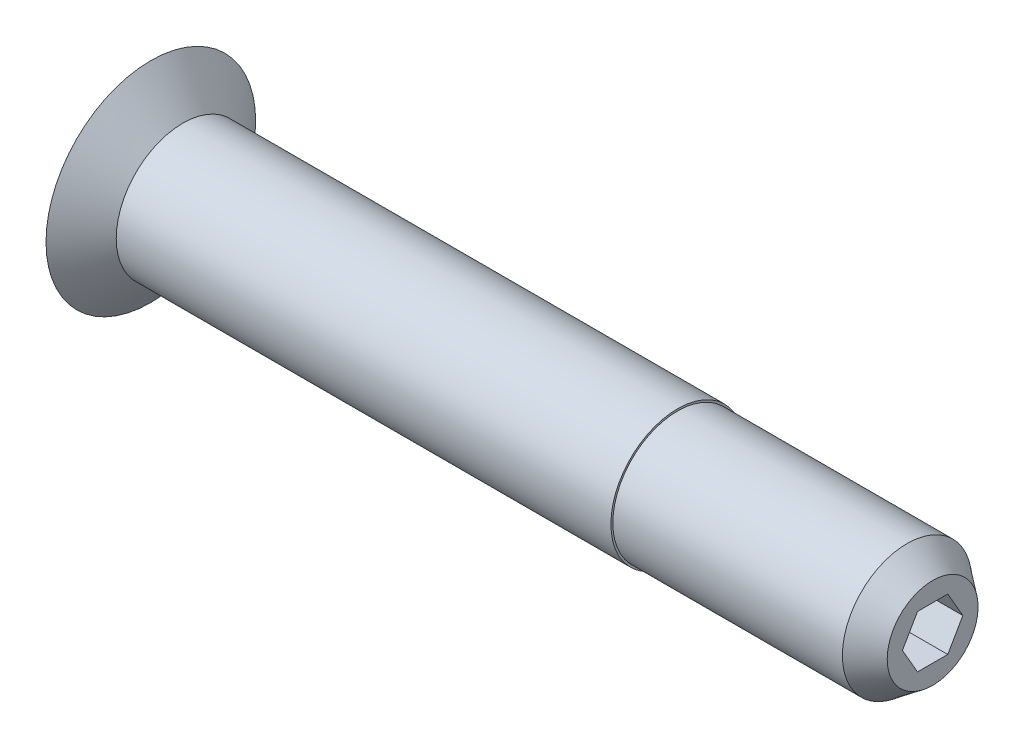
ISO-10303-21;
HEADER;
FILE_DESCRIPTION(('STEP AP214'),'2;1');
FILE_NAME('part.step','',(''),(''),'','','');
FILE_SCHEMA(('AUTOMOTIVE_DESIGN { 1 0 10303 214 1 1 1 1 }'));
ENDSEC;
DATA;
#1=APPLICATION_CONTEXT('core data for automotive mechanical design processes');
#2=APPLICATION_PROTOCOL_DEFINITION('international standard','automotive_design',2000,#1);
#3=PRODUCT_CONTEXT('',#1,'mechanical');
#4=PRODUCT('Part','Part','',(#3));
#5=PRODUCT_RELATED_PRODUCT_CATEGORY('part','',(#4));
#6=PRODUCT_DEFINITION_FORMATION('','',#4);
#7=PRODUCT_DEFINITION_CONTEXT('part definition',#1,'design');
#8=PRODUCT_DEFINITION('design','',#6,#7);
#9=PRODUCT_DEFINITION_SHAPE('','',#8);
#10=(LENGTH_UNIT() NAMED_UNIT(*) SI_UNIT(.MILLI.,.METRE.));
#11=(NAMED_UNIT(*) PLANE_ANGLE_UNIT() SI_UNIT($,.RADIAN.));
#12=(NAMED_UNIT(*) SI_UNIT($,.STERADIAN.) SOLID_ANGLE_UNIT());
#13=UNCERTAINTY_MEASURE_WITH_UNIT(LENGTH_MEASURE(1.E-05),#10,'distance_accuracy_value','');
#14=(GEOMETRIC_REPRESENTATION_CONTEXT(3) GLOBAL_UNCERTAINTY_ASSIGNED_CONTEXT((#13)) GLOBAL_UNIT_ASSIGNED_CONTEXT((#10,
#11,#12)) REPRESENTATION_CONTEXT('',''));
#15=CARTESIAN_POINT('',(0.,0.,0.));
#16=DIRECTION('',(0.,0.,1.));
#17=DIRECTION('',(1.,0.,0.));
#18=AXIS2_PLACEMENT_3D('',#15,#16,#17);
#19=CARTESIAN_POINT('',(21.6916,0.,0.938540597594654));
#20=DIRECTION('',(0.,-0.50000000000001,-0.866025403784433));
#21=DIRECTION('',(0.,-0.866025403784433,0.50000000000001));
#22=AXIS2_PLACEMENT_3D('',#19,#20,#21);
#23=PLANE('',#22);
#24=DIRECTION('',(0.,0.866025403784433,-0.50000000000001));
#25=VECTOR('',#24,1.);
#26=CARTESIAN_POINT('',(24.8666,0.,0.938540597594654));
#27=LINE('',#26,#25);
#28=CARTESIAN_POINT('',(24.8666,0.,0.938540597594654));
#29=VERTEX_POINT('',#28);
#30=CARTESIAN_POINT('',(24.8666,0.8128,0.469270298797319));
#31=VERTEX_POINT('',#30);
#32=EDGE_CURVE('E200',#29,#31,#27,.T.);
#33=ORIENTED_EDGE('',*,*,#32,.F.);
#34=DIRECTION('',(1.,0.,0.));
#35=VECTOR('',#34,1.);
#36=CARTESIAN_POINT('',(21.6916,0.,0.938540597594654));
#37=LINE('',#36,#35);
#38=CARTESIAN_POINT('',(21.6916,0.,0.938540597594654));
#39=VERTEX_POINT('',#38);
#40=EDGE_CURVE('E11',#39,#29,#37,.T.);
#41=ORIENTED_EDGE('',*,*,#40,.F.);
#42=DIRECTION('',(0.,0.866025403784433,-0.50000000000001));
#43=VECTOR('',#42,1.);
#44=CARTESIAN_POINT('',(21.6916,0.,0.938540597594654));
#45=LINE('',#44,#43);
#46=CARTESIAN_POINT('',(21.6916,0.8128,0.469270298797319));
#47=VERTEX_POINT('',#46);
#48=EDGE_CURVE('E155',#39,#47,#45,.T.);
#49=ORIENTED_EDGE('',*,*,#48,.T.);
#50=DIRECTION('',(1.,0.,0.));
#51=VECTOR('',#50,1.);
#52=CARTESIAN_POINT('',(21.6916,0.8128,0.469270298797325));
#53=LINE('',#52,#51);
#54=EDGE_CURVE('E197',#47,#31,#53,.T.);
#55=ORIENTED_EDGE('',*,*,#54,.T.);
#56=EDGE_LOOP('',(#33,#41,#49,#55));
#57=FACE_BOUND('',#56,.T.);
#58=ADVANCED_FACE('F59',(#57),#23,.T.);
#59=CARTESIAN_POINT('',(21.6916,-0.8128,0.469270298797337));
#60=DIRECTION('',(0.,0.499999999999992,-0.866025403784443));
#61=DIRECTION('',(-1.,0.,0.));
#62=AXIS2_PLACEMENT_3D('',#59,#60,#61);
#63=PLANE('',#62);
#64=DIRECTION('',(0.,0.866025403784443,0.499999999999992));
#65=VECTOR('',#64,1.);
#66=CARTESIAN_POINT('',(24.8666,-0.8128,0.469270298797337));
#67=LINE('',#66,#65);
#68=CARTESIAN_POINT('',(24.8666,-0.8128,0.469270298797337));
#69=VERTEX_POINT('',#68);
#70=EDGE_CURVE('E138',#69,#29,#67,.T.);
#71=ORIENTED_EDGE('',*,*,#70,.F.);
#72=DIRECTION('',(1.,0.,0.));
#73=VECTOR('',#72,1.);
#74=CARTESIAN_POINT('',(21.6916,-0.8128,0.469270298797325));
#75=LINE('',#74,#73);
#76=CARTESIAN_POINT('',(21.6916,-0.8128,0.469270298797325));
#77=VERTEX_POINT('',#76);
#78=EDGE_CURVE('E69',#77,#69,#75,.T.);
#79=ORIENTED_EDGE('',*,*,#78,.F.);
#80=DIRECTION('',(0.,0.866025403784443,0.499999999999992));
#81=VECTOR('',#80,1.);
#82=CARTESIAN_POINT('',(21.6916,-0.8128,0.469270298797337));
#83=LINE('',#82,#81);
#84=EDGE_CURVE('E135',#77,#39,#83,.T.);
#85=ORIENTED_EDGE('',*,*,#84,.T.);
#86=ORIENTED_EDGE('',*,*,#40,.T.);
#87=EDGE_LOOP('',(#71,#79,#85,#86));
#88=FACE_BOUND('',#87,.T.);
#89=ADVANCED_FACE('F133',(#88),#63,.T.);
#90=CARTESIAN_POINT('',(21.6916,-0.8128,-0.469270298797325));
#91=DIRECTION('',(0.,1.,0.));
#92=DIRECTION('',(1.,0.,0.));
#93=AXIS2_PLACEMENT_3D('',#90,#91,#92);
#94=PLANE('',#93);
#95=DIRECTION('',(0.,0.,1.));
#96=VECTOR('',#95,1.);
#97=CARTESIAN_POINT('',(24.8666,-0.8128,-0.469270298797325));
#98=LINE('',#97,#96);
#99=CARTESIAN_POINT('',(24.8666,-0.8128,-0.469270298797325));
#100=VERTEX_POINT('',#99);
#101=EDGE_CURVE('E178',#100,#69,#98,.T.);
#102=ORIENTED_EDGE('',*,*,#101,.F.);
#103=DIRECTION('',(1.,0.,0.));
#104=VECTOR('',#103,1.);
#105=CARTESIAN_POINT('',(21.6916,-0.8128,-0.469270298797325));
#106=LINE('',#105,#104);
#107=CARTESIAN_POINT('',(21.6916,-0.8128,-0.469270298797325));
#108=VERTEX_POINT('',#107);
#109=EDGE_CURVE('E62',#108,#100,#106,.T.);
#110=ORIENTED_EDGE('',*,*,#109,.F.);
#111=DIRECTION('',(0.,0.,1.));
#112=VECTOR('',#111,1.);
#113=CARTESIAN_POINT('',(21.6916,-0.8128,-0.469270298797325));
#114=LINE('',#113,#112);
#115=EDGE_CURVE('E145',#108,#77,#114,.T.);
#116=ORIENTED_EDGE('',*,*,#115,.T.);
#117=ORIENTED_EDGE('',*,*,#78,.T.);
#118=EDGE_LOOP('',(#102,#110,#116,#117));
#119=FACE_BOUND('',#118,.T.);
#120=ADVANCED_FACE('F146',(#119),#94,.T.);
#121=CARTESIAN_POINT('',(21.6916,0.,-0.938540597594654));
#122=DIRECTION('',(0.,0.5,0.866025403784436));
#123=DIRECTION('',(1.,0.,0.));
#124=AXIS2_PLACEMENT_3D('',#121,#122,#123);
#125=PLANE('',#124);
#126=DIRECTION('',(0.,-0.866025403784436,0.5));
#127=VECTOR('',#126,1.);
#128=CARTESIAN_POINT('',(24.8666,0.,-0.938540597594654));
#129=LINE('',#128,#127);
#130=CARTESIAN_POINT('',(24.8666,0.,-0.938540597594654));
#131=VERTEX_POINT('',#130);
#132=EDGE_CURVE('E176',#131,#100,#129,.T.);
#133=ORIENTED_EDGE('',*,*,#132,.F.);
#134=DIRECTION('',(1.,0.,0.));
#135=VECTOR('',#134,1.);
#136=CARTESIAN_POINT('',(21.6916,0.,-0.938540597594654));
#137=LINE('',#136,#135);
#138=CARTESIAN_POINT('',(21.6916,0.,-0.938540597594654));
#139=VERTEX_POINT('',#138);
#140=EDGE_CURVE('E82',#139,#131,#137,.T.);
#141=ORIENTED_EDGE('',*,*,#140,.F.);
#142=DIRECTION('',(0.,-0.866025403784436,0.5));
#143=VECTOR('',#142,1.);
#144=CARTESIAN_POINT('',(21.6916,0.,-0.938540597594654));
#145=LINE('',#144,#143);
#146=EDGE_CURVE('E150',#139,#108,#145,.T.);
#147=ORIENTED_EDGE('',*,*,#146,.T.);
#148=ORIENTED_EDGE('',*,*,#109,.T.);
#149=EDGE_LOOP('',(#133,#141,#147,#148));
#150=FACE_BOUND('',#149,.T.);
#151=ADVANCED_FACE('F174',(#150),#125,.T.);
#152=CARTESIAN_POINT('',(21.6916,0.8128,-0.469270298797331));
#153=DIRECTION('',(0.,-0.5,0.86602540378444));
#154=DIRECTION('',(-1.,0.,0.));
#155=AXIS2_PLACEMENT_3D('',#152,#153,#154);
#156=PLANE('',#155);
#157=DIRECTION('',(0.,-0.86602540378444,-0.5));
#158=VECTOR('',#157,1.);
#159=CARTESIAN_POINT('',(24.8666,0.8128,-0.469270298797331));
#160=LINE('',#159,#158);
#161=CARTESIAN_POINT('',(24.8666,0.8128,-0.469270298797331));
#162=VERTEX_POINT('',#161);
#163=EDGE_CURVE('E185',#162,#131,#160,.T.);
#164=ORIENTED_EDGE('',*,*,#163,.F.);
#165=DIRECTION('',(1.,0.,0.));
#166=VECTOR('',#165,1.);
#167=CARTESIAN_POINT('',(21.6916,0.8128,-0.469270298797325));
#168=LINE('',#167,#166);
#169=CARTESIAN_POINT('',(21.6916,0.8128,-0.469270298797331));
#170=VERTEX_POINT('',#169);
#171=EDGE_CURVE('E160',#170,#162,#168,.T.);
#172=ORIENTED_EDGE('',*,*,#171,.F.);
#173=DIRECTION('',(0.,-0.86602540378444,-0.5));
#174=VECTOR('',#173,1.);
#175=CARTESIAN_POINT('',(21.6916,0.8128,-0.469270298797331));
#176=LINE('',#175,#174);
#177=EDGE_CURVE('E166',#170,#139,#176,.T.);
#178=ORIENTED_EDGE('',*,*,#177,.T.);
#179=ORIENTED_EDGE('',*,*,#140,.T.);
#180=EDGE_LOOP('',(#164,#172,#178,#179));
#181=FACE_BOUND('',#180,.T.);
#182=ADVANCED_FACE('F226',(#181),#156,.T.);
#183=CARTESIAN_POINT('',(21.6916,0.,0.));
#184=DIRECTION('',(-1.,0.,0.));
#185=DIRECTION('',(0.,0.,1.));
#186=AXIS2_PLACEMENT_3D('',#183,#184,#185);
#187=PLANE('',#186);
#188=DIRECTION('',(0.,0.,-1.));
#189=VECTOR('',#188,1.);
#190=CARTESIAN_POINT('',(21.6916,0.8128,0.469270298797325));
#191=LINE('',#190,#189);
#192=EDGE_CURVE('E213',#47,#170,#191,.T.);
#193=ORIENTED_EDGE('',*,*,#192,.F.);
#194=ORIENTED_EDGE('',*,*,#48,.F.);
#195=ORIENTED_EDGE('',*,*,#84,.F.);
#196=ORIENTED_EDGE('',*,*,#115,.F.);
#197=ORIENTED_EDGE('',*,*,#146,.F.);
#198=ORIENTED_EDGE('',*,*,#177,.F.);
#199=EDGE_LOOP('',(#193,#194,#195,#196,#197,#198));
#200=FACE_BOUND('',#199,.T.);
#201=ADVANCED_FACE('F153',(#200),#187,.F.);
#202=CARTESIAN_POINT('',(21.6916,0.8128,0.469270298797325));
#203=DIRECTION('',(0.,-1.,0.));
#204=DIRECTION('',(0.,0.,-1.));
#205=AXIS2_PLACEMENT_3D('',#202,#203,#204);
#206=PLANE('',#205);
#207=DIRECTION('',(0.,0.,-1.));
#208=VECTOR('',#207,1.);
#209=CARTESIAN_POINT('',(24.8666,0.8128,0.469270298797325));
#210=LINE('',#209,#208);
#211=EDGE_CURVE('E205',#31,#162,#210,.T.);
#212=ORIENTED_EDGE('',*,*,#211,.F.);
#213=ORIENTED_EDGE('',*,*,#54,.F.);
#214=ORIENTED_EDGE('',*,*,#192,.T.);
#215=ORIENTED_EDGE('',*,*,#171,.T.);
#216=EDGE_LOOP('',(#212,#213,#214,#215));
#217=FACE_BOUND('',#216,.T.);
#218=ADVANCED_FACE('F222',(#217),#206,.T.);
#219=CARTESIAN_POINT('',(-1000.,0.,0.));
#220=DIRECTION('',(-1.,0.,0.));
#221=DIRECTION('',(0.,0.,1.));
#222=AXIS2_PLACEMENT_3D('',#219,#220,#221);
#223=CYLINDRICAL_SURFACE('',#222,2.0701);
#224=CARTESIAN_POINT('',(1.57479999999999,0.,0.));
#225=DIRECTION('',(1.,0.,0.));
#226=DIRECTION('',(0.,0.,-1.));
#227=AXIS2_PLACEMENT_3D('',#224,#225,#226);
#228=CIRCLE('',#227,2.0701);
#229=CARTESIAN_POINT('',(1.57479999999999,0.,-2.0701));
#230=VERTEX_POINT('',#229);
#231=EDGE_CURVE('E264',#230,#230,#228,.F.);
#232=ORIENTED_EDGE('',*,*,#231,.F.);
#233=EDGE_LOOP('',(#232));
#234=FACE_BOUND('',#233,.T.);
#235=CARTESIAN_POINT('',(16.9418,0.,0.));
#236=DIRECTION('',(-1.,0.,0.));
#237=DIRECTION('',(0.,0.,1.));
#238=AXIS2_PLACEMENT_3D('',#235,#236,#237);
#239=CIRCLE('',#238,2.0701);
#240=CARTESIAN_POINT('',(16.9418,0.,2.0701));
#241=VERTEX_POINT('',#240);
#242=EDGE_CURVE('E194',#241,#241,#239,.T.);
#243=ORIENTED_EDGE('',*,*,#242,.T.);
#244=EDGE_LOOP('',(#243));
#245=FACE_BOUND('',#244,.T.);
#246=ADVANCED_FACE('F281',(#234,#245),#223,.T.);
#247=CARTESIAN_POINT('',(16.9418,2.0701,0.));
#248=DIRECTION('',(-1.,0.,0.));
#249=DIRECTION('',(0.,0.,1.));
#250=AXIS2_PLACEMENT_3D('',#247,#248,#249);
#251=PLANE('',#250);
#252=CARTESIAN_POINT('',(16.9418,0.,0.));
#253=DIRECTION('',(-1.,0.,0.));
#254=DIRECTION('',(0.,0.,1.));
#255=AXIS2_PLACEMENT_3D('',#252,#253,#254);
#256=CIRCLE('',#255,2.009775);
#257=CARTESIAN_POINT('',(16.9418,0.,2.009775));
#258=VERTEX_POINT('',#257);
#259=EDGE_CURVE('E198',#258,#258,#256,.T.);
#260=ORIENTED_EDGE('',*,*,#259,.T.);
#261=EDGE_LOOP('',(#260));
#262=FACE_BOUND('',#261,.T.);
#263=ORIENTED_EDGE('',*,*,#242,.F.);
#264=EDGE_LOOP('',(#263));
#265=FACE_BOUND('',#264,.T.);
#266=ADVANCED_FACE('F256',(#262,#265),#251,.F.);
#267=CARTESIAN_POINT('',(-1000.,0.,0.));
#268=DIRECTION('',(-1.,0.,0.));
#269=DIRECTION('',(0.,0.,1.));
#270=AXIS2_PLACEMENT_3D('',#267,#268,#269);
#271=CYLINDRICAL_SURFACE('',#270,2.009775);
#272=ORIENTED_EDGE('',*,*,#259,.F.);
#273=EDGE_LOOP('',(#272));
#274=FACE_BOUND('',#273,.T.);
#275=CARTESIAN_POINT('',(24.07285,0.,0.));
#276=DIRECTION('',(-1.,0.,0.));
#277=DIRECTION('',(0.,0.,1.));
#278=AXIS2_PLACEMENT_3D('',#275,#276,#277);
#279=CIRCLE('',#278,2.009775);
#280=CARTESIAN_POINT('',(24.07285,0.,2.009775));
#281=VERTEX_POINT('',#280);
#282=EDGE_CURVE('E208',#281,#281,#279,.T.);
#283=ORIENTED_EDGE('',*,*,#282,.T.);
#284=EDGE_LOOP('',(#283));
#285=FACE_BOUND('',#284,.T.);
#286=ADVANCED_FACE('F287',(#274,#285),#271,.T.);
#287=CARTESIAN_POINT('',(24.8666,0.,0.));
#288=DIRECTION('',(-1.,0.,0.));
#289=DIRECTION('',(0.,0.,1.));
#290=AXIS2_PLACEMENT_3D('',#287,#288,#289);
#291=CONICAL_SURFACE('',#290,1.41164147273091,0.645771823237948);
#292=CARTESIAN_POINT('',(24.8666,0.,0.));
#293=DIRECTION('',(-1.,0.,0.));
#294=DIRECTION('',(0.,0.,1.));
#295=AXIS2_PLACEMENT_3D('',#292,#293,#294);
#296=CIRCLE('',#295,1.41164147273091);
#297=CARTESIAN_POINT('',(24.8666,0.,1.41164147273091));
#298=VERTEX_POINT('',#297);
#299=EDGE_CURVE('E190',#298,#298,#296,.T.);
#300=ORIENTED_EDGE('',*,*,#299,.T.);
#301=EDGE_LOOP('',(#300));
#302=FACE_BOUND('',#301,.T.);
#303=ORIENTED_EDGE('',*,*,#282,.F.);
#304=EDGE_LOOP('',(#303));
#305=FACE_BOUND('',#304,.T.);
#306=ADVANCED_FACE('F294',(#302,#305),#291,.T.);
#307=CARTESIAN_POINT('',(24.8666,1.41164147273091,0.));
#308=DIRECTION('',(-1.,0.,0.));
#309=DIRECTION('',(0.,0.,1.));
#310=AXIS2_PLACEMENT_3D('',#307,#308,#309);
#311=PLANE('',#310);
#312=ORIENTED_EDGE('',*,*,#163,.T.);
#313=ORIENTED_EDGE('',*,*,#132,.T.);
#314=ORIENTED_EDGE('',*,*,#101,.T.);
#315=ORIENTED_EDGE('',*,*,#70,.T.);
#316=ORIENTED_EDGE('',*,*,#32,.T.);
#317=ORIENTED_EDGE('',*,*,#211,.T.);
#318=EDGE_LOOP('',(#312,#313,#314,#315,#316,#317));
#319=FACE_BOUND('',#318,.T.);
#320=ORIENTED_EDGE('',*,*,#299,.F.);
#321=EDGE_LOOP('',(#320));
#322=FACE_BOUND('',#321,.T.);
#323=ADVANCED_FACE('F182',(#319,#322),#311,.F.);
#324=CARTESIAN_POINT('',(1.57480000000002,0.,0.));
#325=DIRECTION('',(-1.,0.,0.));
#326=DIRECTION('',(0.,-1.,0.));
#327=AXIS2_PLACEMENT_3D('',#324,#325,#326);
#328=CONICAL_SURFACE('',#327,2.0701,0.872664625997172);
#329=CARTESIAN_POINT('',(0.57947679949017,0.,0.));
#330=DIRECTION('',(-1.,0.,0.));
#331=DIRECTION('',(0.,-1.,0.));
#332=AXIS2_PLACEMENT_3D('',#329,#330,#331);
#333=CIRCLE('',#332,3.25628);
#334=CARTESIAN_POINT('',(0.579476799490202,-3.25628000000001,0.));
#335=VERTEX_POINT('',#334);
#336=EDGE_CURVE('E268',#335,#335,#333,.T.);
#337=ORIENTED_EDGE('',*,*,#336,.F.);
#338=EDGE_LOOP('',(#337));
#339=FACE_BOUND('',#338,.T.);
#340=ORIENTED_EDGE('',*,*,#231,.T.);
#341=EDGE_LOOP('',(#340));
#342=FACE_BOUND('',#341,.T.);
#343=ADVANCED_FACE('F275',(#339,#342),#328,.T.);
#344=CARTESIAN_POINT('',(0.579476799490121,3.25627999999999,0.));
#345=DIRECTION('',(1.,0.,0.));
#346=DIRECTION('',(0.,1.,0.));
#347=AXIS2_PLACEMENT_3D('',#344,#345,#346);
#348=PLANE('',#347);
#349=ORIENTED_EDGE('',*,*,#336,.T.);
#350=EDGE_LOOP('',(#349));
#351=FACE_BOUND('',#350,.T.);
#352=ADVANCED_FACE('F273',(#351),#348,.F.);
#353=CLOSED_SHELL('',(#58,#89,#120,#151,#182,#201,#218,#246,#266,#286,#306,#323,#343,#352));
#354=MANIFOLD_SOLID_BREP('B2',#353);
#355=ADVANCED_BREP_SHAPE_REPRESENTATION('',(#18,#354),#14);
#356=SHAPE_DEFINITION_REPRESENTATION(#9,#355);
ENDSEC;
END-ISO-10303-21;
